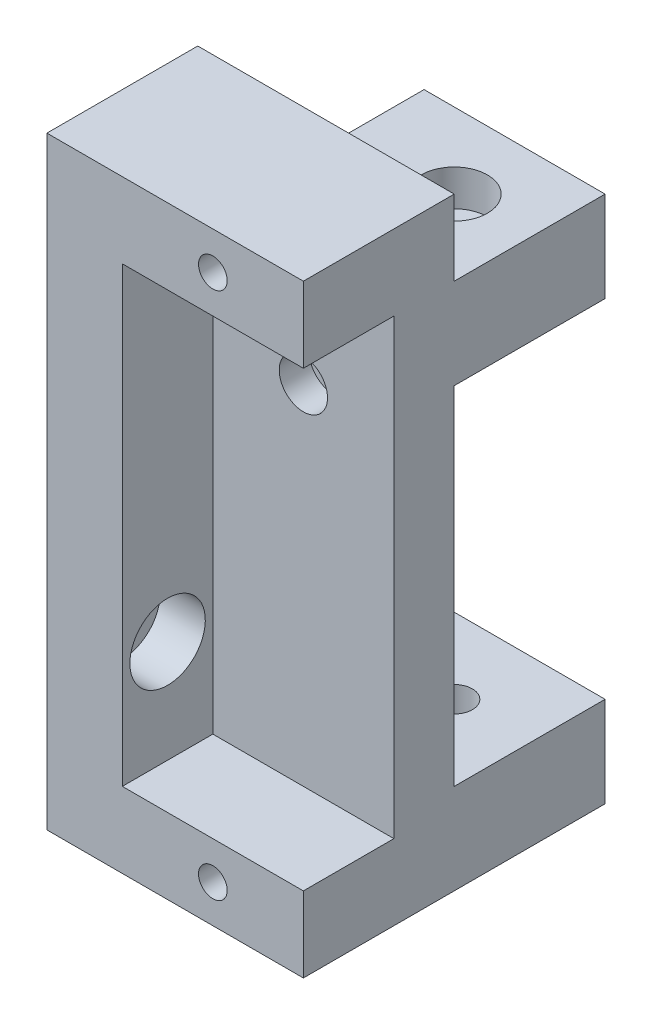
ISO-10303-21;
HEADER;
FILE_DESCRIPTION(('STEP AP214'),'2;1');
FILE_NAME('part.step','',(''),(''),'','','');
FILE_SCHEMA(('AUTOMOTIVE_DESIGN { 1 0 10303 214 1 1 1 1 }'));
ENDSEC;
DATA;
#1=APPLICATION_CONTEXT('core data for automotive mechanical design processes');
#2=APPLICATION_PROTOCOL_DEFINITION('international standard','automotive_design',2000,#1);
#3=PRODUCT_CONTEXT('',#1,'mechanical');
#4=PRODUCT('Part','Part','',(#3));
#5=PRODUCT_RELATED_PRODUCT_CATEGORY('part','',(#4));
#6=PRODUCT_DEFINITION_FORMATION('','',#4);
#7=PRODUCT_DEFINITION_CONTEXT('part definition',#1,'design');
#8=PRODUCT_DEFINITION('design','',#6,#7);
#9=PRODUCT_DEFINITION_SHAPE('','',#8);
#10=(LENGTH_UNIT() NAMED_UNIT(*) SI_UNIT(.MILLI.,.METRE.));
#11=(NAMED_UNIT(*) PLANE_ANGLE_UNIT() SI_UNIT($,.RADIAN.));
#12=(NAMED_UNIT(*) SI_UNIT($,.STERADIAN.) SOLID_ANGLE_UNIT());
#13=UNCERTAINTY_MEASURE_WITH_UNIT(LENGTH_MEASURE(1.E-05),#10,'distance_accuracy_value','');
#14=(GEOMETRIC_REPRESENTATION_CONTEXT(3) GLOBAL_UNCERTAINTY_ASSIGNED_CONTEXT((#13)) GLOBAL_UNIT_ASSIGNED_CONTEXT((#10,
#11,#12)) REPRESENTATION_CONTEXT('',''));
#15=CARTESIAN_POINT('',(0.,0.,0.));
#16=DIRECTION('',(0.,0.,1.));
#17=DIRECTION('',(1.,0.,0.));
#18=AXIS2_PLACEMENT_3D('',#15,#16,#17);
#19=CARTESIAN_POINT('',(-2.,-17.5,4.));
#20=DIRECTION('',(1.,0.,0.));
#21=DIRECTION('',(0.,0.,-1.));
#22=AXIS2_PLACEMENT_3D('',#19,#20,#21);
#23=PLANE('',#22);
#24=DIRECTION('',(0.,-1.,0.));
#25=VECTOR('',#24,1.);
#26=CARTESIAN_POINT('',(-2.,22.5,0.));
#27=LINE('',#26,#25);
#28=CARTESIAN_POINT('',(-2.,17.5,0.));
#29=VERTEX_POINT('',#28);
#30=CARTESIAN_POINT('',(-2.,11.5,0.));
#31=VERTEX_POINT('',#30);
#32=EDGE_CURVE('E11',#29,#31,#27,.T.);
#33=ORIENTED_EDGE('',*,*,#32,.F.);
#34=DIRECTION('',(0.,0.,1.));
#35=VECTOR('',#34,1.);
#36=CARTESIAN_POINT('',(-2.,17.5,-10.));
#37=LINE('',#36,#35);
#38=CARTESIAN_POINT('',(-2.,17.5,-10.));
#39=VERTEX_POINT('',#38);
#40=EDGE_CURVE('E252',#39,#29,#37,.T.);
#41=ORIENTED_EDGE('',*,*,#40,.F.);
#42=DIRECTION('',(0.,-1.,0.));
#43=VECTOR('',#42,1.);
#44=CARTESIAN_POINT('',(-2.,17.5,-10.));
#45=LINE('',#44,#43);
#46=CARTESIAN_POINT('',(-2.,11.5,-10.));
#47=VERTEX_POINT('',#46);
#48=EDGE_CURVE('E228',#39,#47,#45,.T.);
#49=ORIENTED_EDGE('',*,*,#48,.T.);
#50=DIRECTION('',(0.,0.,1.));
#51=VECTOR('',#50,1.);
#52=CARTESIAN_POINT('',(-2.,11.5,-10.));
#53=LINE('',#52,#51);
#54=EDGE_CURVE('E241',#47,#31,#53,.T.);
#55=ORIENTED_EDGE('',*,*,#54,.T.);
#56=EDGE_LOOP('',(#33,#41,#49,#55));
#57=FACE_BOUND('',#56,.T.);
#58=ADVANCED_FACE('F38',(#57),#23,.F.);
#59=CARTESIAN_POINT('',(-2.,-11.5,0.));
#60=VERTEX_POINT('',#59);
#61=CARTESIAN_POINT('',(-2.,-17.5,0.));
#62=VERTEX_POINT('',#61);
#63=EDGE_CURVE('E46',#60,#62,#27,.T.);
#64=ORIENTED_EDGE('',*,*,#63,.F.);
#65=DIRECTION('',(0.,0.,1.));
#66=VECTOR('',#65,1.);
#67=CARTESIAN_POINT('',(-2.,-11.5,-10.));
#68=LINE('',#67,#66);
#69=CARTESIAN_POINT('',(-2.,-11.5,-10.));
#70=VERTEX_POINT('',#69);
#71=EDGE_CURVE('E272',#70,#60,#68,.T.);
#72=ORIENTED_EDGE('',*,*,#71,.F.);
#73=DIRECTION('',(0.,1.,0.));
#74=VECTOR('',#73,1.);
#75=CARTESIAN_POINT('',(-2.,-17.5,-10.));
#76=LINE('',#75,#74);
#77=CARTESIAN_POINT('',(-2.,-17.5,-10.));
#78=VERTEX_POINT('',#77);
#79=EDGE_CURVE('E256',#78,#70,#76,.T.);
#80=ORIENTED_EDGE('',*,*,#79,.F.);
#81=DIRECTION('',(0.,0.,-1.));
#82=VECTOR('',#81,1.);
#83=CARTESIAN_POINT('',(-2.,-17.5,4.));
#84=LINE('',#83,#82);
#85=EDGE_CURVE('E41',#62,#78,#84,.T.);
#86=ORIENTED_EDGE('',*,*,#85,.F.);
#87=EDGE_LOOP('',(#64,#72,#80,#86));
#88=FACE_BOUND('',#87,.T.);
#89=ADVANCED_FACE('F328',(#88),#23,.F.);
#90=CARTESIAN_POINT('',(0.,0.,4.));
#91=DIRECTION('',(0.,0.,-1.));
#92=DIRECTION('',(-1.,0.,0.));
#93=AXIS2_PLACEMENT_3D('',#90,#91,#92);
#94=PLANE('',#93);
#95=CARTESIAN_POINT('',(4.,10.6,4.));
#96=DIRECTION('',(0.,0.,1.));
#97=DIRECTION('',(1.,0.,0.));
#98=AXIS2_PLACEMENT_3D('',#95,#96,#97);
#99=CIRCLE('',#98,1.6);
#100=CARTESIAN_POINT('',(5.6,10.6,4.));
#101=VERTEX_POINT('',#100);
#102=EDGE_CURVE('E221',#101,#101,#99,.T.);
#103=ORIENTED_EDGE('',*,*,#102,.F.);
#104=EDGE_LOOP('',(#103));
#105=FACE_BOUND('',#104,.T.);
#106=DIRECTION('',(-1.,0.,0.));
#107=VECTOR('',#106,1.);
#108=CARTESIAN_POINT('',(-2.,-12.5,4.));
#109=LINE('',#108,#107);
#110=CARTESIAN_POINT('',(10.,-12.5,4.));
#111=VERTEX_POINT('',#110);
#112=CARTESIAN_POINT('',(-2.,-12.5,4.));
#113=VERTEX_POINT('',#112);
#114=EDGE_CURVE('E206',#111,#113,#109,.T.);
#115=ORIENTED_EDGE('',*,*,#114,.F.);
#116=DIRECTION('',(0.,1.,0.));
#117=VECTOR('',#116,1.);
#118=CARTESIAN_POINT('',(10.,-17.5,4.));
#119=LINE('',#118,#117);
#120=CARTESIAN_POINT('',(10.,17.5,4.));
#121=VERTEX_POINT('',#120);
#122=EDGE_CURVE('E277',#111,#121,#119,.T.);
#123=ORIENTED_EDGE('',*,*,#122,.T.);
#124=DIRECTION('',(1.,0.,0.));
#125=VECTOR('',#124,1.);
#126=CARTESIAN_POINT('',(-2.,17.5,4.));
#127=LINE('',#126,#125);
#128=CARTESIAN_POINT('',(-2.,17.5,4.));
#129=VERTEX_POINT('',#128);
#130=EDGE_CURVE('E59',#129,#121,#127,.T.);
#131=ORIENTED_EDGE('',*,*,#130,.F.);
#132=DIRECTION('',(0.,-1.,0.));
#133=VECTOR('',#132,1.);
#134=CARTESIAN_POINT('',(-2.,-17.5,4.));
#135=LINE('',#134,#133);
#136=EDGE_CURVE('E54',#129,#113,#135,.T.);
#137=ORIENTED_EDGE('',*,*,#136,.T.);
#138=EDGE_LOOP('',(#115,#123,#131,#137));
#139=FACE_BOUND('',#138,.T.);
#140=ADVANCED_FACE('F347',(#105,#139),#94,.F.);
#141=CARTESIAN_POINT('',(-2.,-17.5,4.));
#142=DIRECTION('',(0.,1.,0.));
#143=DIRECTION('',(0.,0.,1.));
#144=AXIS2_PLACEMENT_3D('',#141,#142,#143);
#145=PLANE('',#144);
#146=CARTESIAN_POINT('',(5.,-17.5,-5.));
#147=DIRECTION('',(0.,-1.,0.));
#148=DIRECTION('',(0.,0.,-1.));
#149=AXIS2_PLACEMENT_3D('',#146,#147,#148);
#150=CIRCLE('',#149,2.19999999999999);
#151=CARTESIAN_POINT('',(5.,-17.5,-7.19999999999999));
#152=VERTEX_POINT('',#151);
#153=EDGE_CURVE('E605',#152,#152,#150,.T.);
#154=ORIENTED_EDGE('',*,*,#153,.F.);
#155=EDGE_LOOP('',(#154));
#156=FACE_BOUND('',#155,.T.);
#157=DIRECTION('',(1.,0.,0.));
#158=VECTOR('',#157,1.);
#159=CARTESIAN_POINT('',(-2.,-17.5,10.));
#160=LINE('',#159,#158);
#161=CARTESIAN_POINT('',(-7.,-17.5,10.));
#162=VERTEX_POINT('',#161);
#163=CARTESIAN_POINT('',(10.,-17.5,10.));
#164=VERTEX_POINT('',#163);
#165=EDGE_CURVE('E208',#162,#164,#160,.T.);
#166=ORIENTED_EDGE('',*,*,#165,.F.);
#167=DIRECTION('',(0.,0.,1.));
#168=VECTOR('',#167,1.);
#169=CARTESIAN_POINT('',(-7.,-17.5,10.));
#170=LINE('',#169,#168);
#171=CARTESIAN_POINT('',(-7.,-17.5,0.));
#172=VERTEX_POINT('',#171);
#173=EDGE_CURVE('E172',#172,#162,#170,.T.);
#174=ORIENTED_EDGE('',*,*,#173,.F.);
#175=DIRECTION('',(1.,0.,0.));
#176=VECTOR('',#175,1.);
#177=CARTESIAN_POINT('',(-7.,-17.5,0.));
#178=LINE('',#177,#176);
#179=EDGE_CURVE('E183',#172,#62,#178,.T.);
#180=ORIENTED_EDGE('',*,*,#179,.T.);
#181=ORIENTED_EDGE('',*,*,#85,.T.);
#182=DIRECTION('',(-1.,0.,0.));
#183=VECTOR('',#182,1.);
#184=CARTESIAN_POINT('',(-2.,-17.5,-10.));
#185=LINE('',#184,#183);
#186=CARTESIAN_POINT('',(10.,-17.5,-10.));
#187=VERTEX_POINT('',#186);
#188=EDGE_CURVE('E264',#187,#78,#185,.T.);
#189=ORIENTED_EDGE('',*,*,#188,.F.);
#190=DIRECTION('',(0.,0.,-1.));
#191=VECTOR('',#190,1.);
#192=CARTESIAN_POINT('',(10.,-17.5,4.));
#193=LINE('',#192,#191);
#194=EDGE_CURVE('E284',#164,#187,#193,.T.);
#195=ORIENTED_EDGE('',*,*,#194,.F.);
#196=EDGE_LOOP('',(#166,#174,#180,#181,#189,#195));
#197=FACE_BOUND('',#196,.T.);
#198=ADVANCED_FACE('F297',(#156,#197),#145,.F.);
#199=CARTESIAN_POINT('',(10.,-17.5,4.));
#200=DIRECTION('',(-1.,0.,0.));
#201=DIRECTION('',(0.,0.,1.));
#202=AXIS2_PLACEMENT_3D('',#199,#200,#201);
#203=PLANE('',#202);
#204=ORIENTED_EDGE('',*,*,#194,.T.);
#205=DIRECTION('',(0.,-1.,0.));
#206=VECTOR('',#205,1.);
#207=CARTESIAN_POINT('',(10.,-17.5,-10.));
#208=LINE('',#207,#206);
#209=CARTESIAN_POINT('',(10.,-11.5,-10.));
#210=VERTEX_POINT('',#209);
#211=EDGE_CURVE('E261',#210,#187,#208,.T.);
#212=ORIENTED_EDGE('',*,*,#211,.F.);
#213=DIRECTION('',(0.,0.,1.));
#214=VECTOR('',#213,1.);
#215=CARTESIAN_POINT('',(10.,-11.5,-10.));
#216=LINE('',#215,#214);
#217=CARTESIAN_POINT('',(10.,-11.5,0.));
#218=VERTEX_POINT('',#217);
#219=EDGE_CURVE('E267',#210,#218,#216,.T.);
#220=ORIENTED_EDGE('',*,*,#219,.T.);
#221=DIRECTION('',(0.,1.,0.));
#222=VECTOR('',#221,1.);
#223=CARTESIAN_POINT('',(10.,-17.5,0.));
#224=LINE('',#223,#222);
#225=CARTESIAN_POINT('',(10.,11.5,0.));
#226=VERTEX_POINT('',#225);
#227=EDGE_CURVE('E280',#218,#226,#224,.T.);
#228=ORIENTED_EDGE('',*,*,#227,.T.);
#229=DIRECTION('',(0.,0.,1.));
#230=VECTOR('',#229,1.);
#231=CARTESIAN_POINT('',(10.,11.5,-10.));
#232=LINE('',#231,#230);
#233=CARTESIAN_POINT('',(10.,11.5,-10.));
#234=VERTEX_POINT('',#233);
#235=EDGE_CURVE('E246',#234,#226,#232,.T.);
#236=ORIENTED_EDGE('',*,*,#235,.F.);
#237=DIRECTION('',(0.,1.,0.));
#238=VECTOR('',#237,1.);
#239=CARTESIAN_POINT('',(10.,17.5,-10.));
#240=LINE('',#239,#238);
#241=CARTESIAN_POINT('',(10.,17.5,-10.));
#242=VERTEX_POINT('',#241);
#243=EDGE_CURVE('E235',#234,#242,#240,.T.);
#244=ORIENTED_EDGE('',*,*,#243,.T.);
#245=DIRECTION('',(0.,0.,1.));
#246=VECTOR('',#245,1.);
#247=CARTESIAN_POINT('',(10.,17.5,-10.));
#248=LINE('',#247,#246);
#249=CARTESIAN_POINT('',(10.,17.5,0.));
#250=VERTEX_POINT('',#249);
#251=EDGE_CURVE('E249',#242,#250,#248,.T.);
#252=ORIENTED_EDGE('',*,*,#251,.T.);
#253=CARTESIAN_POINT('',(10.,22.5,0.));
#254=VERTEX_POINT('',#253);
#255=EDGE_CURVE('E275',#250,#254,#224,.T.);
#256=ORIENTED_EDGE('',*,*,#255,.T.);
#257=DIRECTION('',(0.,0.,-1.));
#258=VECTOR('',#257,1.);
#259=CARTESIAN_POINT('',(10.,22.5,4.));
#260=LINE('',#259,#258);
#261=CARTESIAN_POINT('',(10.,22.5,10.));
#262=VERTEX_POINT('',#261);
#263=EDGE_CURVE('E279',#262,#254,#260,.T.);
#264=ORIENTED_EDGE('',*,*,#263,.F.);
#265=DIRECTION('',(0.,1.,0.));
#266=VECTOR('',#265,1.);
#267=CARTESIAN_POINT('',(10.,22.5,10.));
#268=LINE('',#267,#266);
#269=CARTESIAN_POINT('',(10.,17.5,10.));
#270=VERTEX_POINT('',#269);
#271=EDGE_CURVE('E155',#270,#262,#268,.T.);
#272=ORIENTED_EDGE('',*,*,#271,.F.);
#273=DIRECTION('',(0.,0.,-1.));
#274=VECTOR('',#273,1.);
#275=CARTESIAN_POINT('',(10.,17.5,10.));
#276=LINE('',#275,#274);
#277=EDGE_CURVE('E158',#270,#121,#276,.T.);
#278=ORIENTED_EDGE('',*,*,#277,.T.);
#279=ORIENTED_EDGE('',*,*,#122,.F.);
#280=DIRECTION('',(0.,0.,-1.));
#281=VECTOR('',#280,1.);
#282=CARTESIAN_POINT('',(10.,-12.5,10.));
#283=LINE('',#282,#281);
#284=CARTESIAN_POINT('',(10.,-12.5,10.));
#285=VERTEX_POINT('',#284);
#286=EDGE_CURVE('E191',#285,#111,#283,.T.);
#287=ORIENTED_EDGE('',*,*,#286,.F.);
#288=DIRECTION('',(0.,1.,0.));
#289=VECTOR('',#288,1.);
#290=CARTESIAN_POINT('',(10.,-17.5,10.));
#291=LINE('',#290,#289);
#292=EDGE_CURVE('E210',#164,#285,#291,.T.);
#293=ORIENTED_EDGE('',*,*,#292,.F.);
#294=EDGE_LOOP('',(#204,#212,#220,#228,#236,#244,#252,#256,#264,#272,#278,#279,#287,#293));
#295=FACE_BOUND('',#294,.T.);
#296=ADVANCED_FACE('F299',(#295),#203,.F.);
#297=CARTESIAN_POINT('',(-2.,22.5,4.));
#298=DIRECTION('',(0.,-1.,0.));
#299=DIRECTION('',(0.,0.,-1.));
#300=AXIS2_PLACEMENT_3D('',#297,#298,#299);
#301=PLANE('',#300);
#302=DIRECTION('',(-1.,0.,0.));
#303=VECTOR('',#302,1.);
#304=CARTESIAN_POINT('',(-2.,22.5,0.));
#305=LINE('',#304,#303);
#306=CARTESIAN_POINT('',(-7.,22.5,0.));
#307=VERTEX_POINT('',#306);
#308=EDGE_CURVE('E164',#254,#307,#305,.T.);
#309=ORIENTED_EDGE('',*,*,#308,.T.);
#310=DIRECTION('',(0.,0.,-1.));
#311=VECTOR('',#310,1.);
#312=CARTESIAN_POINT('',(-7.,22.5,10.));
#313=LINE('',#312,#311);
#314=CARTESIAN_POINT('',(-7.,22.5,10.));
#315=VERTEX_POINT('',#314);
#316=EDGE_CURVE('E161',#315,#307,#313,.T.);
#317=ORIENTED_EDGE('',*,*,#316,.F.);
#318=DIRECTION('',(-1.,0.,0.));
#319=VECTOR('',#318,1.);
#320=CARTESIAN_POINT('',(-2.,22.5,10.));
#321=LINE('',#320,#319);
#322=EDGE_CURVE('E147',#262,#315,#321,.T.);
#323=ORIENTED_EDGE('',*,*,#322,.F.);
#324=ORIENTED_EDGE('',*,*,#263,.T.);
#325=EDGE_LOOP('',(#309,#317,#323,#324));
#326=FACE_BOUND('',#325,.T.);
#327=ADVANCED_FACE('F162',(#326),#301,.F.);
#328=CARTESIAN_POINT('',(0.,0.,0.));
#329=DIRECTION('',(0.,0.,-1.));
#330=DIRECTION('',(-1.,0.,0.));
#331=AXIS2_PLACEMENT_3D('',#328,#329,#330);
#332=PLANE('',#331);
#333=DIRECTION('',(1.,0.,0.));
#334=VECTOR('',#333,1.);
#335=CARTESIAN_POINT('',(-2.,11.5,0.));
#336=LINE('',#335,#334);
#337=EDGE_CURVE('E232',#31,#226,#336,.T.);
#338=ORIENTED_EDGE('',*,*,#337,.T.);
#339=ORIENTED_EDGE('',*,*,#227,.F.);
#340=DIRECTION('',(1.,0.,0.));
#341=VECTOR('',#340,1.);
#342=CARTESIAN_POINT('',(-2.,-11.5,0.));
#343=LINE('',#342,#341);
#344=EDGE_CURVE('E255',#60,#218,#343,.T.);
#345=ORIENTED_EDGE('',*,*,#344,.F.);
#346=ORIENTED_EDGE('',*,*,#63,.T.);
#347=ORIENTED_EDGE('',*,*,#179,.F.);
#348=DIRECTION('',(0.,-1.,0.));
#349=VECTOR('',#348,1.);
#350=CARTESIAN_POINT('',(-7.,22.5,0.));
#351=LINE('',#350,#349);
#352=EDGE_CURVE('E167',#307,#172,#351,.T.);
#353=ORIENTED_EDGE('',*,*,#352,.F.);
#354=ORIENTED_EDGE('',*,*,#308,.F.);
#355=ORIENTED_EDGE('',*,*,#255,.F.);
#356=DIRECTION('',(-1.,0.,0.));
#357=VECTOR('',#356,1.);
#358=CARTESIAN_POINT('',(-2.,17.5,0.));
#359=LINE('',#358,#357);
#360=EDGE_CURVE('E225',#250,#29,#359,.T.);
#361=ORIENTED_EDGE('',*,*,#360,.T.);
#362=ORIENTED_EDGE('',*,*,#32,.T.);
#363=EDGE_LOOP('',(#338,#339,#345,#346,#347,#353,#354,#355,#361,#362));
#364=FACE_BOUND('',#363,.T.);
#365=ADVANCED_FACE('F294',(#364),#332,.T.);
#366=CARTESIAN_POINT('',(-2.,-11.5,-10.));
#367=DIRECTION('',(0.,-1.,0.));
#368=DIRECTION('',(0.,0.,-1.));
#369=AXIS2_PLACEMENT_3D('',#366,#367,#368);
#370=PLANE('',#369);
#371=CARTESIAN_POINT('',(5.,-11.5,-5.));
#372=DIRECTION('',(0.,-1.,0.));
#373=DIRECTION('',(0.,0.,-1.));
#374=AXIS2_PLACEMENT_3D('',#371,#372,#373);
#375=CIRCLE('',#374,1.20000000000001);
#376=CARTESIAN_POINT('',(5.,-11.5,-6.20000000000001));
#377=VERTEX_POINT('',#376);
#378=EDGE_CURVE('E621',#377,#377,#375,.T.);
#379=ORIENTED_EDGE('',*,*,#378,.T.);
#380=EDGE_LOOP('',(#379));
#381=FACE_BOUND('',#380,.T.);
#382=ORIENTED_EDGE('',*,*,#344,.T.);
#383=ORIENTED_EDGE('',*,*,#219,.F.);
#384=DIRECTION('',(1.,0.,0.));
#385=VECTOR('',#384,1.);
#386=CARTESIAN_POINT('',(-2.,-11.5,-10.));
#387=LINE('',#386,#385);
#388=EDGE_CURVE('E259',#70,#210,#387,.T.);
#389=ORIENTED_EDGE('',*,*,#388,.F.);
#390=ORIENTED_EDGE('',*,*,#71,.T.);
#391=EDGE_LOOP('',(#382,#383,#389,#390));
#392=FACE_BOUND('',#391,.T.);
#393=ADVANCED_FACE('F326',(#381,#392),#370,.F.);
#394=CARTESIAN_POINT('',(0.,0.,-10.));
#395=DIRECTION('',(0.,0.,-1.));
#396=DIRECTION('',(-1.,0.,0.));
#397=AXIS2_PLACEMENT_3D('',#394,#395,#396);
#398=PLANE('',#397);
#399=ORIENTED_EDGE('',*,*,#79,.T.);
#400=ORIENTED_EDGE('',*,*,#388,.T.);
#401=ORIENTED_EDGE('',*,*,#211,.T.);
#402=ORIENTED_EDGE('',*,*,#188,.T.);
#403=EDGE_LOOP('',(#399,#400,#401,#402));
#404=FACE_BOUND('',#403,.T.);
#405=ADVANCED_FACE('F330',(#404),#398,.T.);
#406=CARTESIAN_POINT('',(-2.,17.5,-10.));
#407=DIRECTION('',(0.,1.,0.));
#408=DIRECTION('',(0.,0.,1.));
#409=AXIS2_PLACEMENT_3D('',#406,#407,#408);
#410=PLANE('',#409);
#411=CARTESIAN_POINT('',(5.,17.5,-5.));
#412=DIRECTION('',(0.,1.,0.));
#413=DIRECTION('',(0.,0.,1.));
#414=AXIS2_PLACEMENT_3D('',#411,#412,#413);
#415=CIRCLE('',#414,2.19999999999999);
#416=CARTESIAN_POINT('',(5.,17.5,-2.80000000000001));
#417=VERTEX_POINT('',#416);
#418=EDGE_CURVE('E637',#417,#417,#415,.T.);
#419=ORIENTED_EDGE('',*,*,#418,.F.);
#420=EDGE_LOOP('',(#419));
#421=FACE_BOUND('',#420,.T.);
#422=ORIENTED_EDGE('',*,*,#360,.F.);
#423=ORIENTED_EDGE('',*,*,#251,.F.);
#424=DIRECTION('',(-1.,0.,0.));
#425=VECTOR('',#424,1.);
#426=CARTESIAN_POINT('',(-2.,17.5,-10.));
#427=LINE('',#426,#425);
#428=EDGE_CURVE('E231',#242,#39,#427,.T.);
#429=ORIENTED_EDGE('',*,*,#428,.T.);
#430=ORIENTED_EDGE('',*,*,#40,.T.);
#431=EDGE_LOOP('',(#422,#423,#429,#430));
#432=FACE_BOUND('',#431,.T.);
#433=ADVANCED_FACE('F315',(#421,#432),#410,.T.);
#434=CARTESIAN_POINT('',(-2.,11.5,-10.));
#435=DIRECTION('',(0.,-1.,0.));
#436=DIRECTION('',(0.,0.,-1.));
#437=AXIS2_PLACEMENT_3D('',#434,#435,#436);
#438=PLANE('',#437);
#439=CARTESIAN_POINT('',(5.,11.5,-5.));
#440=DIRECTION('',(0.,-1.,0.));
#441=DIRECTION('',(0.,0.,-1.));
#442=AXIS2_PLACEMENT_3D('',#439,#440,#441);
#443=CIRCLE('',#442,1.20000000000001);
#444=CARTESIAN_POINT('',(5.,11.5,-6.20000000000001));
#445=VERTEX_POINT('',#444);
#446=EDGE_CURVE('E603',#445,#445,#443,.T.);
#447=ORIENTED_EDGE('',*,*,#446,.F.);
#448=EDGE_LOOP('',(#447));
#449=FACE_BOUND('',#448,.T.);
#450=ORIENTED_EDGE('',*,*,#337,.F.);
#451=ORIENTED_EDGE('',*,*,#54,.F.);
#452=DIRECTION('',(1.,0.,0.));
#453=VECTOR('',#452,1.);
#454=CARTESIAN_POINT('',(-2.,11.5,-10.));
#455=LINE('',#454,#453);
#456=EDGE_CURVE('E238',#47,#234,#455,.T.);
#457=ORIENTED_EDGE('',*,*,#456,.T.);
#458=ORIENTED_EDGE('',*,*,#235,.T.);
#459=EDGE_LOOP('',(#450,#451,#457,#458));
#460=FACE_BOUND('',#459,.T.);
#461=ADVANCED_FACE('F323',(#449,#460),#438,.T.);
#462=CARTESIAN_POINT('',(0.,0.,-10.));
#463=DIRECTION('',(0.,0.,-1.));
#464=DIRECTION('',(-1.,0.,0.));
#465=AXIS2_PLACEMENT_3D('',#462,#463,#464);
#466=PLANE('',#465);
#467=ORIENTED_EDGE('',*,*,#48,.F.);
#468=ORIENTED_EDGE('',*,*,#428,.F.);
#469=ORIENTED_EDGE('',*,*,#243,.F.);
#470=ORIENTED_EDGE('',*,*,#456,.F.);
#471=EDGE_LOOP('',(#467,#468,#469,#470));
#472=FACE_BOUND('',#471,.T.);
#473=ADVANCED_FACE('F320',(#472),#466,.T.);
#474=CARTESIAN_POINT('',(4.,10.6,2.));
#475=DIRECTION('',(0.,0.,1.));
#476=DIRECTION('',(1.,0.,0.));
#477=AXIS2_PLACEMENT_3D('',#474,#475,#476);
#478=CYLINDRICAL_SURFACE('',#477,1.6);
#479=CARTESIAN_POINT('',(4.,10.6,2.));
#480=DIRECTION('',(0.,0.,1.));
#481=DIRECTION('',(1.,0.,0.));
#482=AXIS2_PLACEMENT_3D('',#479,#480,#481);
#483=CIRCLE('',#482,1.6);
#484=CARTESIAN_POINT('',(5.6,10.6,2.));
#485=VERTEX_POINT('',#484);
#486=EDGE_CURVE('E222',#485,#485,#483,.T.);
#487=ORIENTED_EDGE('',*,*,#486,.F.);
#488=EDGE_LOOP('',(#487));
#489=FACE_BOUND('',#488,.T.);
#490=ORIENTED_EDGE('',*,*,#102,.T.);
#491=EDGE_LOOP('',(#490));
#492=FACE_BOUND('',#491,.T.);
#493=ADVANCED_FACE('F593',(#489,#492),#478,.F.);
#494=CARTESIAN_POINT('',(4.,10.6,2.));
#495=DIRECTION('',(0.,0.,1.));
#496=DIRECTION('',(1.,0.,0.));
#497=AXIS2_PLACEMENT_3D('',#494,#495,#496);
#498=PLANE('',#497);
#499=ORIENTED_EDGE('',*,*,#486,.T.);
#500=EDGE_LOOP('',(#499));
#501=FACE_BOUND('',#500,.T.);
#502=ADVANCED_FACE('F372',(#501),#498,.T.);
#503=CARTESIAN_POINT('',(-2.,17.5,10.));
#504=DIRECTION('',(0.,1.,0.));
#505=DIRECTION('',(-1.,0.,0.));
#506=AXIS2_PLACEMENT_3D('',#503,#504,#505);
#507=PLANE('',#506);
#508=ORIENTED_EDGE('',*,*,#130,.T.);
#509=ORIENTED_EDGE('',*,*,#277,.F.);
#510=DIRECTION('',(1.,0.,0.));
#511=VECTOR('',#510,1.);
#512=CARTESIAN_POINT('',(-2.,17.5,10.));
#513=LINE('',#512,#511);
#514=CARTESIAN_POINT('',(-2.,17.5,10.));
#515=VERTEX_POINT('',#514);
#516=EDGE_CURVE('E213',#515,#270,#513,.T.);
#517=ORIENTED_EDGE('',*,*,#516,.F.);
#518=DIRECTION('',(0.,0.,-1.));
#519=VECTOR('',#518,1.);
#520=CARTESIAN_POINT('',(-2.,17.5,10.));
#521=LINE('',#520,#519);
#522=EDGE_CURVE('E219',#515,#129,#521,.T.);
#523=ORIENTED_EDGE('',*,*,#522,.T.);
#524=EDGE_LOOP('',(#508,#509,#517,#523));
#525=FACE_BOUND('',#524,.T.);
#526=ADVANCED_FACE('F310',(#525),#507,.F.);
#527=CARTESIAN_POINT('',(0.,0.,10.));
#528=DIRECTION('',(0.,0.,1.));
#529=DIRECTION('',(1.,0.,0.));
#530=AXIS2_PLACEMENT_3D('',#527,#528,#529);
#531=PLANE('',#530);
#532=CARTESIAN_POINT('',(4.,20.,10.));
#533=DIRECTION('',(0.,0.,1.));
#534=DIRECTION('',(-1.,0.,0.));
#535=AXIS2_PLACEMENT_3D('',#532,#533,#534);
#536=CIRCLE('',#535,0.95);
#537=CARTESIAN_POINT('',(3.05,20.,10.));
#538=VERTEX_POINT('',#537);
#539=EDGE_CURVE('E195',#538,#538,#536,.T.);
#540=ORIENTED_EDGE('',*,*,#539,.F.);
#541=EDGE_LOOP('',(#540));
#542=FACE_BOUND('',#541,.T.);
#543=ORIENTED_EDGE('',*,*,#322,.T.);
#544=DIRECTION('',(0.,1.,0.));
#545=VECTOR('',#544,1.);
#546=CARTESIAN_POINT('',(-7.,22.5,10.));
#547=LINE('',#546,#545);
#548=EDGE_CURVE('E153',#162,#315,#547,.T.);
#549=ORIENTED_EDGE('',*,*,#548,.F.);
#550=ORIENTED_EDGE('',*,*,#165,.T.);
#551=ORIENTED_EDGE('',*,*,#292,.T.);
#552=DIRECTION('',(-1.,0.,0.));
#553=VECTOR('',#552,1.);
#554=CARTESIAN_POINT('',(-2.,-12.5,10.));
#555=LINE('',#554,#553);
#556=CARTESIAN_POINT('',(-2.,-12.5,10.));
#557=VERTEX_POINT('',#556);
#558=EDGE_CURVE('E205',#285,#557,#555,.T.);
#559=ORIENTED_EDGE('',*,*,#558,.T.);
#560=DIRECTION('',(0.,1.,0.));
#561=VECTOR('',#560,1.);
#562=CARTESIAN_POINT('',(-2.,22.5,10.));
#563=LINE('',#562,#561);
#564=EDGE_CURVE('E173',#557,#515,#563,.T.);
#565=ORIENTED_EDGE('',*,*,#564,.T.);
#566=ORIENTED_EDGE('',*,*,#516,.T.);
#567=ORIENTED_EDGE('',*,*,#271,.T.);
#568=EDGE_LOOP('',(#543,#549,#550,#551,#559,#565,#566,#567));
#569=FACE_BOUND('',#568,.T.);
#570=CARTESIAN_POINT('',(4.,-15.,10.));
#571=DIRECTION('',(0.,0.,1.));
#572=DIRECTION('',(1.,0.,0.));
#573=AXIS2_PLACEMENT_3D('',#570,#571,#572);
#574=CIRCLE('',#573,0.95);
#575=CARTESIAN_POINT('',(4.95,-15.,10.));
#576=VERTEX_POINT('',#575);
#577=EDGE_CURVE('E192',#576,#576,#574,.T.);
#578=ORIENTED_EDGE('',*,*,#577,.F.);
#579=EDGE_LOOP('',(#578));
#580=FACE_BOUND('',#579,.T.);
#581=ADVANCED_FACE('F149',(#542,#569,#580),#531,.T.);
#582=CARTESIAN_POINT('',(-2.,-12.5,10.));
#583=DIRECTION('',(0.,-1.,0.));
#584=DIRECTION('',(0.,0.,-1.));
#585=AXIS2_PLACEMENT_3D('',#582,#583,#584);
#586=PLANE('',#585);
#587=ORIENTED_EDGE('',*,*,#114,.T.);
#588=DIRECTION('',(0.,0.,-1.));
#589=VECTOR('',#588,1.);
#590=CARTESIAN_POINT('',(-2.,-12.5,10.));
#591=LINE('',#590,#589);
#592=EDGE_CURVE('E202',#557,#113,#591,.T.);
#593=ORIENTED_EDGE('',*,*,#592,.F.);
#594=ORIENTED_EDGE('',*,*,#558,.F.);
#595=ORIENTED_EDGE('',*,*,#286,.T.);
#596=EDGE_LOOP('',(#587,#593,#594,#595));
#597=FACE_BOUND('',#596,.T.);
#598=ADVANCED_FACE('F303',(#597),#586,.F.);
#599=CARTESIAN_POINT('',(4.,-15.,5.));
#600=DIRECTION('',(0.,0.,1.));
#601=DIRECTION('',(1.,0.,0.));
#602=AXIS2_PLACEMENT_3D('',#599,#600,#601);
#603=CYLINDRICAL_SURFACE('',#602,0.95);
#604=CARTESIAN_POINT('',(4.,-15.,5.));
#605=DIRECTION('',(0.,0.,1.));
#606=DIRECTION('',(1.,0.,0.));
#607=AXIS2_PLACEMENT_3D('',#604,#605,#606);
#608=CIRCLE('',#607,0.95);
#609=CARTESIAN_POINT('',(4.95,-15.,5.));
#610=VERTEX_POINT('',#609);
#611=EDGE_CURVE('E188',#610,#610,#608,.T.);
#612=ORIENTED_EDGE('',*,*,#611,.F.);
#613=EDGE_LOOP('',(#612));
#614=FACE_BOUND('',#613,.T.);
#615=ORIENTED_EDGE('',*,*,#577,.T.);
#616=EDGE_LOOP('',(#615));
#617=FACE_BOUND('',#616,.T.);
#618=ADVANCED_FACE('F376',(#614,#617),#603,.F.);
#619=CARTESIAN_POINT('',(4.,-15.,5.));
#620=DIRECTION('',(0.,0.,1.));
#621=DIRECTION('',(1.,0.,0.));
#622=AXIS2_PLACEMENT_3D('',#619,#620,#621);
#623=PLANE('',#622);
#624=ORIENTED_EDGE('',*,*,#611,.T.);
#625=EDGE_LOOP('',(#624));
#626=FACE_BOUND('',#625,.T.);
#627=ADVANCED_FACE('F380',(#626),#623,.T.);
#628=CARTESIAN_POINT('',(4.,20.,5.));
#629=DIRECTION('',(0.,0.,1.));
#630=DIRECTION('',(1.,0.,0.));
#631=AXIS2_PLACEMENT_3D('',#628,#629,#630);
#632=CYLINDRICAL_SURFACE('',#631,0.95);
#633=CARTESIAN_POINT('',(4.,20.,5.));
#634=DIRECTION('',(0.,0.,1.));
#635=DIRECTION('',(-1.,0.,0.));
#636=AXIS2_PLACEMENT_3D('',#633,#634,#635);
#637=CIRCLE('',#636,0.95);
#638=CARTESIAN_POINT('',(3.05,20.,5.));
#639=VERTEX_POINT('',#638);
#640=EDGE_CURVE('E187',#639,#639,#637,.T.);
#641=ORIENTED_EDGE('',*,*,#640,.F.);
#642=EDGE_LOOP('',(#641));
#643=FACE_BOUND('',#642,.T.);
#644=ORIENTED_EDGE('',*,*,#539,.T.);
#645=EDGE_LOOP('',(#644));
#646=FACE_BOUND('',#645,.T.);
#647=ADVANCED_FACE('F390',(#643,#646),#632,.F.);
#648=CARTESIAN_POINT('',(4.,20.,5.));
#649=DIRECTION('',(0.,0.,-1.));
#650=DIRECTION('',(-1.,0.,0.));
#651=AXIS2_PLACEMENT_3D('',#648,#649,#650);
#652=PLANE('',#651);
#653=ORIENTED_EDGE('',*,*,#640,.T.);
#654=EDGE_LOOP('',(#653));
#655=FACE_BOUND('',#654,.T.);
#656=ADVANCED_FACE('F398',(#655),#652,.F.);
#657=CARTESIAN_POINT('',(-7.,0.,0.));
#658=DIRECTION('',(1.,0.,0.));
#659=DIRECTION('',(0.,1.,0.));
#660=AXIS2_PLACEMENT_3D('',#657,#658,#659);
#661=PLANE('',#660);
#662=ORIENTED_EDGE('',*,*,#548,.T.);
#663=ORIENTED_EDGE('',*,*,#316,.T.);
#664=ORIENTED_EDGE('',*,*,#352,.T.);
#665=ORIENTED_EDGE('',*,*,#173,.T.);
#666=EDGE_LOOP('',(#662,#663,#664,#665));
#667=FACE_BOUND('',#666,.T.);
#668=ADVANCED_FACE('F170',(#667),#661,.F.);
#669=CARTESIAN_POINT('',(-2.,0.,0.));
#670=DIRECTION('',(1.,0.,0.));
#671=DIRECTION('',(0.,1.,0.));
#672=AXIS2_PLACEMENT_3D('',#669,#670,#671);
#673=PLANE('',#672);
#674=CARTESIAN_POINT('',(-2.,-5.7,7.));
#675=DIRECTION('',(1.,0.,0.));
#676=DIRECTION('',(0.,1.,0.));
#677=AXIS2_PLACEMENT_3D('',#674,#675,#676);
#678=CIRCLE('',#677,2.5);
#679=CARTESIAN_POINT('',(-2.,-3.2,7.));
#680=VERTEX_POINT('',#679);
#681=EDGE_CURVE('E179',#680,#680,#678,.T.);
#682=ORIENTED_EDGE('',*,*,#681,.F.);
#683=EDGE_LOOP('',(#682));
#684=FACE_BOUND('',#683,.T.);
#685=ORIENTED_EDGE('',*,*,#564,.F.);
#686=ORIENTED_EDGE('',*,*,#592,.T.);
#687=ORIENTED_EDGE('',*,*,#136,.F.);
#688=ORIENTED_EDGE('',*,*,#522,.F.);
#689=EDGE_LOOP('',(#685,#686,#687,#688));
#690=FACE_BOUND('',#689,.T.);
#691=ADVANCED_FACE('F308',(#684,#690),#673,.T.);
#692=CARTESIAN_POINT('',(-5.,-5.7,7.));
#693=DIRECTION('',(1.,0.,0.));
#694=DIRECTION('',(0.,1.,0.));
#695=AXIS2_PLACEMENT_3D('',#692,#693,#694);
#696=CYLINDRICAL_SURFACE('',#695,2.5);
#697=CARTESIAN_POINT('',(-5.,-5.7,7.));
#698=DIRECTION('',(1.,0.,0.));
#699=DIRECTION('',(0.,1.,0.));
#700=AXIS2_PLACEMENT_3D('',#697,#698,#699);
#701=CIRCLE('',#700,2.5);
#702=CARTESIAN_POINT('',(-5.,-3.2,7.));
#703=VERTEX_POINT('',#702);
#704=EDGE_CURVE('E176',#703,#703,#701,.T.);
#705=ORIENTED_EDGE('',*,*,#704,.F.);
#706=EDGE_LOOP('',(#705));
#707=FACE_BOUND('',#706,.T.);
#708=ORIENTED_EDGE('',*,*,#681,.T.);
#709=EDGE_LOOP('',(#708));
#710=FACE_BOUND('',#709,.T.);
#711=ADVANCED_FACE('F506',(#707,#710),#696,.F.);
#712=CARTESIAN_POINT('',(-5.,-5.7,7.));
#713=DIRECTION('',(1.,0.,0.));
#714=DIRECTION('',(0.,1.,0.));
#715=AXIS2_PLACEMENT_3D('',#712,#713,#714);
#716=PLANE('',#715);
#717=ORIENTED_EDGE('',*,*,#704,.T.);
#718=EDGE_LOOP('',(#717));
#719=FACE_BOUND('',#718,.T.);
#720=ADVANCED_FACE('F514',(#719),#716,.T.);
#721=CARTESIAN_POINT('',(5.,-17.5,-5.));
#722=DIRECTION('',(0.,-1.,0.));
#723=DIRECTION('',(0.,0.,-1.));
#724=AXIS2_PLACEMENT_3D('',#721,#722,#723);
#725=CYLINDRICAL_SURFACE('',#724,1.20000000000001);
#726=ORIENTED_EDGE('',*,*,#378,.F.);
#727=EDGE_LOOP('',(#726));
#728=FACE_BOUND('',#727,.T.);
#729=CARTESIAN_POINT('',(5.,-15.1,-5.));
#730=DIRECTION('',(0.,-1.,0.));
#731=DIRECTION('',(0.,0.,-1.));
#732=AXIS2_PLACEMENT_3D('',#729,#730,#731);
#733=CIRCLE('',#732,1.20000000000001);
#734=CARTESIAN_POINT('',(5.,-15.1,-6.20000000000001));
#735=VERTEX_POINT('',#734);
#736=EDGE_CURVE('E618',#735,#735,#733,.T.);
#737=ORIENTED_EDGE('',*,*,#736,.T.);
#738=EDGE_LOOP('',(#737));
#739=FACE_BOUND('',#738,.T.);
#740=ADVANCED_FACE('F522',(#728,#739),#725,.F.);
#741=CARTESIAN_POINT('',(6.20000000000001,-15.1,-5.));
#742=DIRECTION('',(0.,1.,0.));
#743=DIRECTION('',(0.,0.,1.));
#744=AXIS2_PLACEMENT_3D('',#741,#742,#743);
#745=PLANE('',#744);
#746=ORIENTED_EDGE('',*,*,#736,.F.);
#747=EDGE_LOOP('',(#746));
#748=FACE_BOUND('',#747,.T.);
#749=CARTESIAN_POINT('',(5.,-15.1,-5.));
#750=DIRECTION('',(0.,-1.,0.));
#751=DIRECTION('',(0.,0.,-1.));
#752=AXIS2_PLACEMENT_3D('',#749,#750,#751);
#753=CIRCLE('',#752,2.19999999999999);
#754=CARTESIAN_POINT('',(5.,-15.1,-7.19999999999999));
#755=VERTEX_POINT('',#754);
#756=EDGE_CURVE('E609',#755,#755,#753,.T.);
#757=ORIENTED_EDGE('',*,*,#756,.T.);
#758=EDGE_LOOP('',(#757));
#759=FACE_BOUND('',#758,.T.);
#760=ADVANCED_FACE('F535',(#748,#759),#745,.F.);
#761=CARTESIAN_POINT('',(5.,-17.5,-5.));
#762=DIRECTION('',(0.,-1.,0.));
#763=DIRECTION('',(0.,0.,-1.));
#764=AXIS2_PLACEMENT_3D('',#761,#762,#763);
#765=CYLINDRICAL_SURFACE('',#764,2.19999999999999);
#766=ORIENTED_EDGE('',*,*,#756,.F.);
#767=EDGE_LOOP('',(#766));
#768=FACE_BOUND('',#767,.T.);
#769=ORIENTED_EDGE('',*,*,#153,.T.);
#770=EDGE_LOOP('',(#769));
#771=FACE_BOUND('',#770,.T.);
#772=ADVANCED_FACE('F545',(#768,#771),#765,.F.);
#773=CARTESIAN_POINT('',(5.,17.5,-5.));
#774=DIRECTION('',(0.,1.,0.));
#775=DIRECTION('',(0.,0.,1.));
#776=AXIS2_PLACEMENT_3D('',#773,#774,#775);
#777=CYLINDRICAL_SURFACE('',#776,1.20000000000001);
#778=CARTESIAN_POINT('',(5.,15.1,-5.));
#779=DIRECTION('',(0.,1.,0.));
#780=DIRECTION('',(0.,0.,1.));
#781=AXIS2_PLACEMENT_3D('',#778,#779,#780);
#782=CIRCLE('',#781,1.20000000000001);
#783=CARTESIAN_POINT('',(5.,15.1,-3.79999999999999));
#784=VERTEX_POINT('',#783);
#785=EDGE_CURVE('E606',#784,#784,#782,.T.);
#786=ORIENTED_EDGE('',*,*,#785,.T.);
#787=EDGE_LOOP('',(#786));
#788=FACE_BOUND('',#787,.T.);
#789=ORIENTED_EDGE('',*,*,#446,.T.);
#790=EDGE_LOOP('',(#789));
#791=FACE_BOUND('',#790,.T.);
#792=ADVANCED_FACE('F555',(#788,#791),#777,.F.);
#793=CARTESIAN_POINT('',(6.20000000000001,15.1,-5.));
#794=DIRECTION('',(0.,-1.,0.));
#795=DIRECTION('',(0.,0.,-1.));
#796=AXIS2_PLACEMENT_3D('',#793,#794,#795);
#797=PLANE('',#796);
#798=ORIENTED_EDGE('',*,*,#785,.F.);
#799=EDGE_LOOP('',(#798));
#800=FACE_BOUND('',#799,.T.);
#801=CARTESIAN_POINT('',(5.,15.1,-5.));
#802=DIRECTION('',(0.,1.,0.));
#803=DIRECTION('',(0.,0.,1.));
#804=AXIS2_PLACEMENT_3D('',#801,#802,#803);
#805=CIRCLE('',#804,2.19999999999999);
#806=CARTESIAN_POINT('',(5.,15.1,-2.80000000000001));
#807=VERTEX_POINT('',#806);
#808=EDGE_CURVE('E612',#807,#807,#805,.T.);
#809=ORIENTED_EDGE('',*,*,#808,.T.);
#810=EDGE_LOOP('',(#809));
#811=FACE_BOUND('',#810,.T.);
#812=ADVANCED_FACE('F565',(#800,#811),#797,.F.);
#813=CARTESIAN_POINT('',(5.,17.5,-5.));
#814=DIRECTION('',(0.,1.,0.));
#815=DIRECTION('',(0.,0.,1.));
#816=AXIS2_PLACEMENT_3D('',#813,#814,#815);
#817=CYLINDRICAL_SURFACE('',#816,2.19999999999999);
#818=ORIENTED_EDGE('',*,*,#808,.F.);
#819=EDGE_LOOP('',(#818));
#820=FACE_BOUND('',#819,.T.);
#821=ORIENTED_EDGE('',*,*,#418,.T.);
#822=EDGE_LOOP('',(#821));
#823=FACE_BOUND('',#822,.T.);
#824=ADVANCED_FACE('F576',(#820,#823),#817,.F.);
#825=CLOSED_SHELL('',(#58,#89,#140,#198,#296,#327,#365,#393,#405,#433,#461,#473,#493,#502,#526,
#581,#598,#618,#627,#647,#656,#668,#691,#711,#720,#740,#760,#772,#792,#812,#824));
#826=MANIFOLD_SOLID_BREP('B2',#825);
#827=ADVANCED_BREP_SHAPE_REPRESENTATION('',(#18,#826),#14);
#828=SHAPE_DEFINITION_REPRESENTATION(#9,#827);
ENDSEC;
END-ISO-10303-21;
